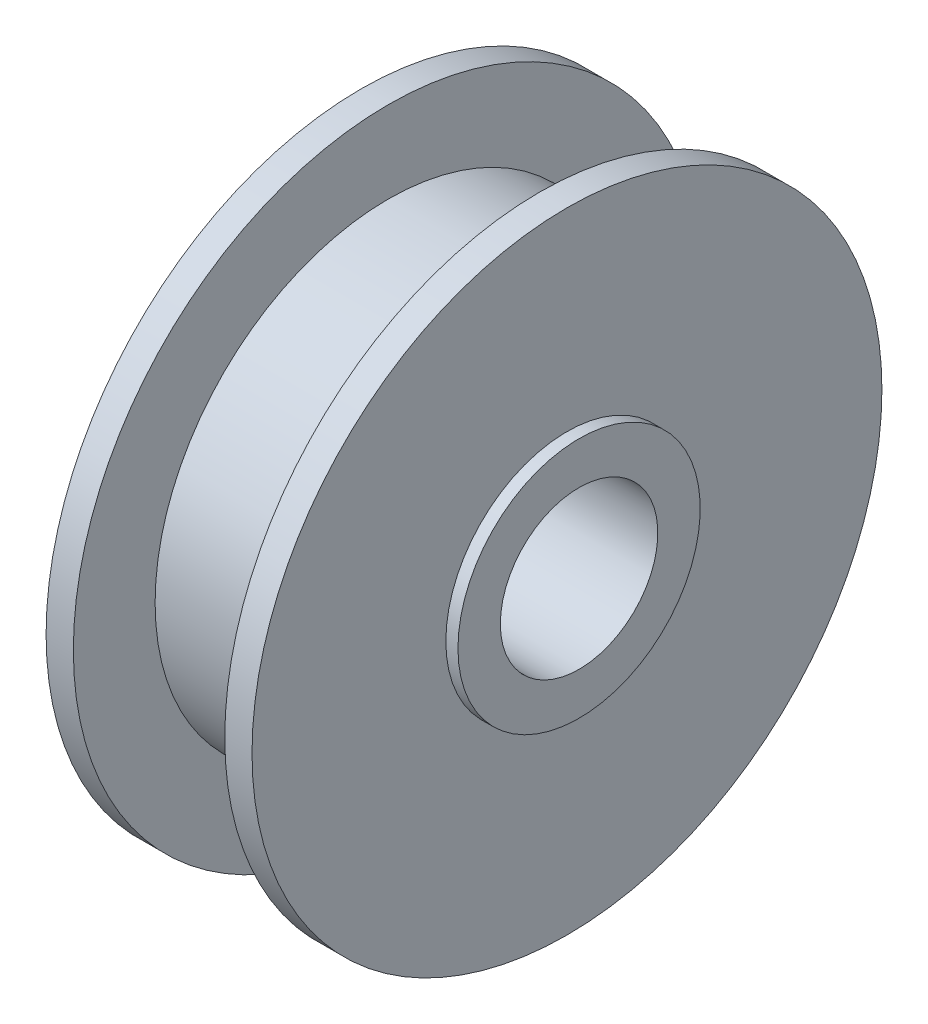
ISO-10303-21;
HEADER;
FILE_DESCRIPTION(('STEP AP214'),'2;1');
FILE_NAME('part.step','',(''),(''),'','','');
FILE_SCHEMA(('AUTOMOTIVE_DESIGN { 1 0 10303 214 1 1 1 1 }'));
ENDSEC;
DATA;
#1=APPLICATION_CONTEXT('core data for automotive mechanical design processes');
#2=APPLICATION_PROTOCOL_DEFINITION('international standard','automotive_design',2000,#1);
#3=PRODUCT_CONTEXT('',#1,'mechanical');
#4=PRODUCT('Part','Part','',(#3));
#5=PRODUCT_RELATED_PRODUCT_CATEGORY('part','',(#4));
#6=PRODUCT_DEFINITION_FORMATION('','',#4);
#7=PRODUCT_DEFINITION_CONTEXT('part definition',#1,'design');
#8=PRODUCT_DEFINITION('design','',#6,#7);
#9=PRODUCT_DEFINITION_SHAPE('','',#8);
#10=(LENGTH_UNIT() NAMED_UNIT(*) SI_UNIT(.MILLI.,.METRE.));
#11=(NAMED_UNIT(*) PLANE_ANGLE_UNIT() SI_UNIT($,.RADIAN.));
#12=(NAMED_UNIT(*) SI_UNIT($,.STERADIAN.) SOLID_ANGLE_UNIT());
#13=UNCERTAINTY_MEASURE_WITH_UNIT(LENGTH_MEASURE(1.E-05),#10,'distance_accuracy_value','');
#14=(GEOMETRIC_REPRESENTATION_CONTEXT(3) GLOBAL_UNCERTAINTY_ASSIGNED_CONTEXT((#13)) GLOBAL_UNIT_ASSIGNED_CONTEXT((#10,
#11,#12)) REPRESENTATION_CONTEXT('',''));
#15=CARTESIAN_POINT('',(0.,0.,0.));
#16=DIRECTION('',(0.,0.,1.));
#17=DIRECTION('',(1.,0.,0.));
#18=AXIS2_PLACEMENT_3D('',#15,#16,#17);
#19=CARTESIAN_POINT('',(-1.9,0.,0.));
#20=DIRECTION('',(-1.,0.,0.));
#21=DIRECTION('',(0.,0.,1.));
#22=AXIS2_PLACEMENT_3D('',#19,#20,#21);
#23=CYLINDRICAL_SURFACE('',#22,1.3);
#24=CARTESIAN_POINT('',(1.9,0.,0.));
#25=DIRECTION('',(-1.,0.,0.));
#26=DIRECTION('',(0.,0.,1.));
#27=AXIS2_PLACEMENT_3D('',#24,#25,#26);
#28=CIRCLE('',#27,1.3);
#29=CARTESIAN_POINT('',(1.9,0.,1.3));
#30=VERTEX_POINT('',#29);
#31=EDGE_CURVE('E71',#30,#30,#28,.T.);
#32=ORIENTED_EDGE('',*,*,#31,.F.);
#33=EDGE_LOOP('',(#32));
#34=FACE_BOUND('',#33,.T.);
#35=CARTESIAN_POINT('',(-1.9,0.,0.));
#36=DIRECTION('',(-1.,0.,0.));
#37=DIRECTION('',(0.,0.,1.));
#38=AXIS2_PLACEMENT_3D('',#35,#36,#37);
#39=CIRCLE('',#38,1.3);
#40=CARTESIAN_POINT('',(-1.9,0.,1.3));
#41=VERTEX_POINT('',#40);
#42=EDGE_CURVE('E10',#41,#41,#39,.T.);
#43=ORIENTED_EDGE('',*,*,#42,.T.);
#44=EDGE_LOOP('',(#43));
#45=FACE_BOUND('',#44,.T.);
#46=ADVANCED_FACE('F31',(#34,#45),#23,.F.);
#47=CARTESIAN_POINT('',(-1.9,1.3,0.));
#48=DIRECTION('',(1.,0.,0.));
#49=DIRECTION('',(0.,0.,-1.));
#50=AXIS2_PLACEMENT_3D('',#47,#48,#49);
#51=PLANE('',#50);
#52=ORIENTED_EDGE('',*,*,#42,.F.);
#53=EDGE_LOOP('',(#52));
#54=FACE_BOUND('',#53,.T.);
#55=CARTESIAN_POINT('',(-1.9,0.,0.));
#56=DIRECTION('',(-1.,0.,0.));
#57=DIRECTION('',(0.,0.,1.));
#58=AXIS2_PLACEMENT_3D('',#55,#56,#57);
#59=CIRCLE('',#58,2.);
#60=CARTESIAN_POINT('',(-1.9,0.,2.));
#61=VERTEX_POINT('',#60);
#62=EDGE_CURVE('E37',#61,#61,#59,.T.);
#63=ORIENTED_EDGE('',*,*,#62,.T.);
#64=EDGE_LOOP('',(#63));
#65=FACE_BOUND('',#64,.T.);
#66=ADVANCED_FACE('F78',(#54,#65),#51,.F.);
#67=CARTESIAN_POINT('',(-1.9,0.,0.));
#68=DIRECTION('',(-1.,0.,0.));
#69=DIRECTION('',(0.,0.,1.));
#70=AXIS2_PLACEMENT_3D('',#67,#68,#69);
#71=CYLINDRICAL_SURFACE('',#70,2.);
#72=ORIENTED_EDGE('',*,*,#62,.F.);
#73=EDGE_LOOP('',(#72));
#74=FACE_BOUND('',#73,.T.);
#75=CARTESIAN_POINT('',(-1.7,0.,0.));
#76=DIRECTION('',(-1.,0.,0.));
#77=DIRECTION('',(0.,0.,1.));
#78=AXIS2_PLACEMENT_3D('',#75,#76,#77);
#79=CIRCLE('',#78,2.);
#80=CARTESIAN_POINT('',(-1.7,0.,2.));
#81=VERTEX_POINT('',#80);
#82=EDGE_CURVE('E41',#81,#81,#79,.T.);
#83=ORIENTED_EDGE('',*,*,#82,.T.);
#84=EDGE_LOOP('',(#83));
#85=FACE_BOUND('',#84,.T.);
#86=ADVANCED_FACE('F82',(#74,#85),#71,.T.);
#87=CARTESIAN_POINT('',(-1.7,2.,0.));
#88=DIRECTION('',(1.,0.,0.));
#89=DIRECTION('',(0.,0.,-1.));
#90=AXIS2_PLACEMENT_3D('',#87,#88,#89);
#91=PLANE('',#90);
#92=ORIENTED_EDGE('',*,*,#82,.F.);
#93=EDGE_LOOP('',(#92));
#94=FACE_BOUND('',#93,.T.);
#95=CARTESIAN_POINT('',(-1.7,0.,0.));
#96=DIRECTION('',(-1.,0.,0.));
#97=DIRECTION('',(0.,0.,1.));
#98=AXIS2_PLACEMENT_3D('',#95,#96,#97);
#99=CIRCLE('',#98,5.2);
#100=CARTESIAN_POINT('',(-1.7,0.,5.2));
#101=VERTEX_POINT('',#100);
#102=EDGE_CURVE('E45',#101,#101,#99,.T.);
#103=ORIENTED_EDGE('',*,*,#102,.T.);
#104=EDGE_LOOP('',(#103));
#105=FACE_BOUND('',#104,.T.);
#106=ADVANCED_FACE('F87',(#94,#105),#91,.F.);
#107=CARTESIAN_POINT('',(-1.9,0.,0.));
#108=DIRECTION('',(-1.,0.,0.));
#109=DIRECTION('',(0.,0.,1.));
#110=AXIS2_PLACEMENT_3D('',#107,#108,#109);
#111=CYLINDRICAL_SURFACE('',#110,5.2);
#112=ORIENTED_EDGE('',*,*,#102,.F.);
#113=EDGE_LOOP('',(#112));
#114=FACE_BOUND('',#113,.T.);
#115=CARTESIAN_POINT('',(-1.25,0.,0.));
#116=DIRECTION('',(-1.,0.,0.));
#117=DIRECTION('',(0.,0.,1.));
#118=AXIS2_PLACEMENT_3D('',#115,#116,#117);
#119=CIRCLE('',#118,5.2);
#120=CARTESIAN_POINT('',(-1.25,0.,5.2));
#121=VERTEX_POINT('',#120);
#122=EDGE_CURVE('E50',#121,#121,#119,.T.);
#123=ORIENTED_EDGE('',*,*,#122,.T.);
#124=EDGE_LOOP('',(#123));
#125=FACE_BOUND('',#124,.T.);
#126=ADVANCED_FACE('F93',(#114,#125),#111,.T.);
#127=CARTESIAN_POINT('',(-1.25,5.2,0.));
#128=DIRECTION('',(-1.,0.,0.));
#129=DIRECTION('',(0.,0.,1.));
#130=AXIS2_PLACEMENT_3D('',#127,#128,#129);
#131=PLANE('',#130);
#132=ORIENTED_EDGE('',*,*,#122,.F.);
#133=EDGE_LOOP('',(#132));
#134=FACE_BOUND('',#133,.T.);
#135=CARTESIAN_POINT('',(-1.25,0.,0.));
#136=DIRECTION('',(-1.,0.,0.));
#137=DIRECTION('',(0.,0.,1.));
#138=AXIS2_PLACEMENT_3D('',#135,#136,#137);
#139=CIRCLE('',#138,3.85);
#140=CARTESIAN_POINT('',(-1.25,0.,3.85));
#141=VERTEX_POINT('',#140);
#142=EDGE_CURVE('E53',#141,#141,#139,.T.);
#143=ORIENTED_EDGE('',*,*,#142,.T.);
#144=EDGE_LOOP('',(#143));
#145=FACE_BOUND('',#144,.T.);
#146=ADVANCED_FACE('F97',(#134,#145),#131,.F.);
#147=CARTESIAN_POINT('',(-1.9,0.,0.));
#148=DIRECTION('',(-1.,0.,0.));
#149=DIRECTION('',(0.,0.,1.));
#150=AXIS2_PLACEMENT_3D('',#147,#148,#149);
#151=CYLINDRICAL_SURFACE('',#150,3.85);
#152=ORIENTED_EDGE('',*,*,#142,.F.);
#153=EDGE_LOOP('',(#152));
#154=FACE_BOUND('',#153,.T.);
#155=CARTESIAN_POINT('',(1.25,0.,0.));
#156=DIRECTION('',(-1.,0.,0.));
#157=DIRECTION('',(0.,0.,1.));
#158=AXIS2_PLACEMENT_3D('',#155,#156,#157);
#159=CIRCLE('',#158,3.85);
#160=CARTESIAN_POINT('',(1.25,0.,3.85));
#161=VERTEX_POINT('',#160);
#162=EDGE_CURVE('E56',#161,#161,#159,.T.);
#163=ORIENTED_EDGE('',*,*,#162,.T.);
#164=EDGE_LOOP('',(#163));
#165=FACE_BOUND('',#164,.T.);
#166=ADVANCED_FACE('F101',(#154,#165),#151,.T.);
#167=CARTESIAN_POINT('',(1.25,3.85,0.));
#168=DIRECTION('',(1.,0.,0.));
#169=DIRECTION('',(0.,0.,-1.));
#170=AXIS2_PLACEMENT_3D('',#167,#168,#169);
#171=PLANE('',#170);
#172=ORIENTED_EDGE('',*,*,#162,.F.);
#173=EDGE_LOOP('',(#172));
#174=FACE_BOUND('',#173,.T.);
#175=CARTESIAN_POINT('',(1.25,0.,0.));
#176=DIRECTION('',(-1.,0.,0.));
#177=DIRECTION('',(0.,0.,1.));
#178=AXIS2_PLACEMENT_3D('',#175,#176,#177);
#179=CIRCLE('',#178,5.2);
#180=CARTESIAN_POINT('',(1.25,0.,5.2));
#181=VERTEX_POINT('',#180);
#182=EDGE_CURVE('E59',#181,#181,#179,.T.);
#183=ORIENTED_EDGE('',*,*,#182,.T.);
#184=EDGE_LOOP('',(#183));
#185=FACE_BOUND('',#184,.T.);
#186=ADVANCED_FACE('F105',(#174,#185),#171,.F.);
#187=CARTESIAN_POINT('',(-1.9,0.,0.));
#188=DIRECTION('',(-1.,0.,0.));
#189=DIRECTION('',(0.,0.,1.));
#190=AXIS2_PLACEMENT_3D('',#187,#188,#189);
#191=CYLINDRICAL_SURFACE('',#190,5.2);
#192=ORIENTED_EDGE('',*,*,#182,.F.);
#193=EDGE_LOOP('',(#192));
#194=FACE_BOUND('',#193,.T.);
#195=CARTESIAN_POINT('',(1.7,0.,0.));
#196=DIRECTION('',(-1.,0.,0.));
#197=DIRECTION('',(0.,0.,1.));
#198=AXIS2_PLACEMENT_3D('',#195,#196,#197);
#199=CIRCLE('',#198,5.2);
#200=CARTESIAN_POINT('',(1.7,0.,5.2));
#201=VERTEX_POINT('',#200);
#202=EDGE_CURVE('E62',#201,#201,#199,.T.);
#203=ORIENTED_EDGE('',*,*,#202,.T.);
#204=EDGE_LOOP('',(#203));
#205=FACE_BOUND('',#204,.T.);
#206=ADVANCED_FACE('F109',(#194,#205),#191,.T.);
#207=CARTESIAN_POINT('',(1.7,5.2,0.));
#208=DIRECTION('',(-1.,0.,0.));
#209=DIRECTION('',(0.,0.,1.));
#210=AXIS2_PLACEMENT_3D('',#207,#208,#209);
#211=PLANE('',#210);
#212=ORIENTED_EDGE('',*,*,#202,.F.);
#213=EDGE_LOOP('',(#212));
#214=FACE_BOUND('',#213,.T.);
#215=CARTESIAN_POINT('',(1.7,0.,0.));
#216=DIRECTION('',(-1.,0.,0.));
#217=DIRECTION('',(0.,0.,1.));
#218=AXIS2_PLACEMENT_3D('',#215,#216,#217);
#219=CIRCLE('',#218,2.);
#220=CARTESIAN_POINT('',(1.7,0.,2.));
#221=VERTEX_POINT('',#220);
#222=EDGE_CURVE('E65',#221,#221,#219,.T.);
#223=ORIENTED_EDGE('',*,*,#222,.T.);
#224=EDGE_LOOP('',(#223));
#225=FACE_BOUND('',#224,.T.);
#226=ADVANCED_FACE('F113',(#214,#225),#211,.F.);
#227=CARTESIAN_POINT('',(-1.9,0.,0.));
#228=DIRECTION('',(-1.,0.,0.));
#229=DIRECTION('',(0.,0.,1.));
#230=AXIS2_PLACEMENT_3D('',#227,#228,#229);
#231=CYLINDRICAL_SURFACE('',#230,2.);
#232=ORIENTED_EDGE('',*,*,#222,.F.);
#233=EDGE_LOOP('',(#232));
#234=FACE_BOUND('',#233,.T.);
#235=CARTESIAN_POINT('',(1.9,0.,0.));
#236=DIRECTION('',(-1.,0.,0.));
#237=DIRECTION('',(0.,0.,1.));
#238=AXIS2_PLACEMENT_3D('',#235,#236,#237);
#239=CIRCLE('',#238,2.);
#240=CARTESIAN_POINT('',(1.9,0.,2.));
#241=VERTEX_POINT('',#240);
#242=EDGE_CURVE('E68',#241,#241,#239,.T.);
#243=ORIENTED_EDGE('',*,*,#242,.T.);
#244=EDGE_LOOP('',(#243));
#245=FACE_BOUND('',#244,.T.);
#246=ADVANCED_FACE('F117',(#234,#245),#231,.T.);
#247=CARTESIAN_POINT('',(1.9,2.,0.));
#248=DIRECTION('',(-1.,0.,0.));
#249=DIRECTION('',(0.,0.,1.));
#250=AXIS2_PLACEMENT_3D('',#247,#248,#249);
#251=PLANE('',#250);
#252=ORIENTED_EDGE('',*,*,#242,.F.);
#253=EDGE_LOOP('',(#252));
#254=FACE_BOUND('',#253,.T.);
#255=ORIENTED_EDGE('',*,*,#31,.T.);
#256=EDGE_LOOP('',(#255));
#257=FACE_BOUND('',#256,.T.);
#258=ADVANCED_FACE('F75',(#254,#257),#251,.F.);
#259=CLOSED_SHELL('',(#46,#66,#86,#106,#126,#146,#166,#186,#206,#226,#246,#258));
#260=MANIFOLD_SOLID_BREP('B2',#259);
#261=ADVANCED_BREP_SHAPE_REPRESENTATION('',(#18,#260),#14);
#262=SHAPE_DEFINITION_REPRESENTATION(#9,#261);
ENDSEC;
END-ISO-10303-21;
